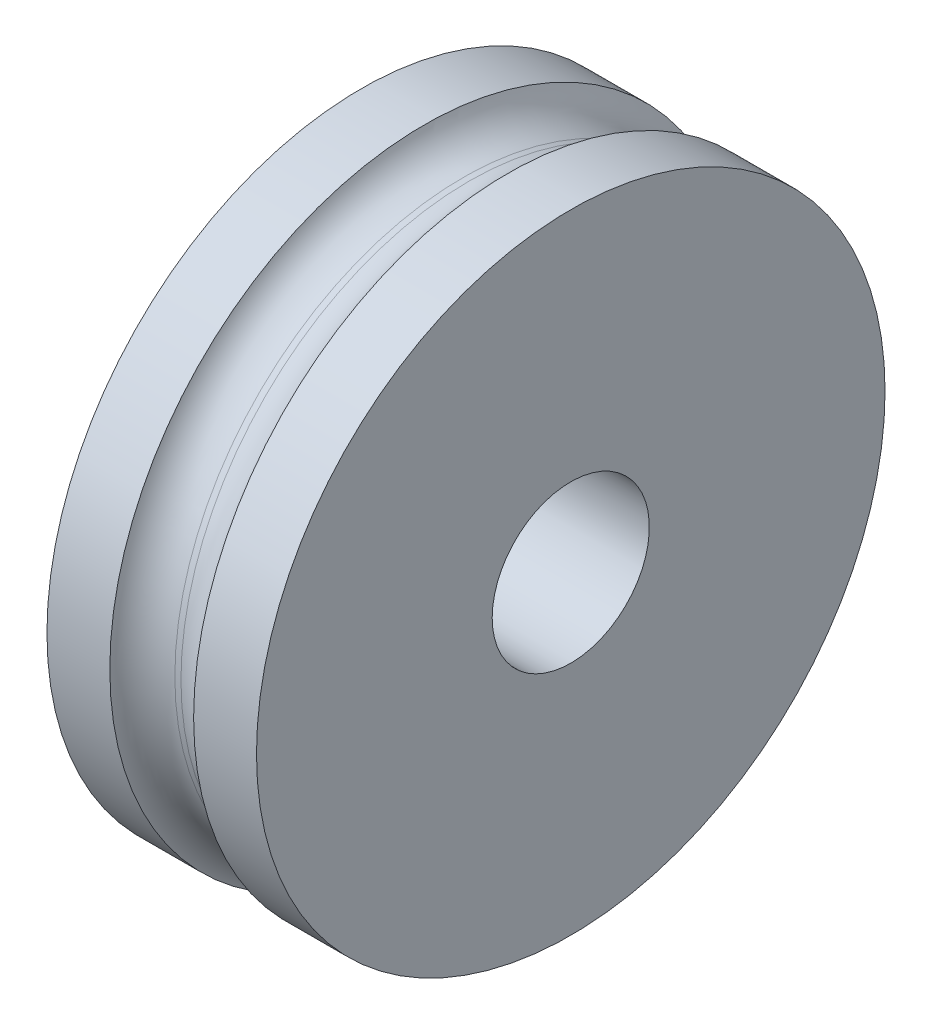
ISO-10303-21;
HEADER;
FILE_DESCRIPTION(('STEP AP214'),'2;1');
FILE_NAME('part.step','',(''),(''),'','','');
FILE_SCHEMA(('AUTOMOTIVE_DESIGN { 1 0 10303 214 1 1 1 1 }'));
ENDSEC;
DATA;
#1=APPLICATION_CONTEXT('core data for automotive mechanical design processes');
#2=APPLICATION_PROTOCOL_DEFINITION('international standard','automotive_design',2000,#1);
#3=PRODUCT_CONTEXT('',#1,'mechanical');
#4=PRODUCT('Part','Part','',(#3));
#5=PRODUCT_RELATED_PRODUCT_CATEGORY('part','',(#4));
#6=PRODUCT_DEFINITION_FORMATION('','',#4);
#7=PRODUCT_DEFINITION_CONTEXT('part definition',#1,'design');
#8=PRODUCT_DEFINITION('design','',#6,#7);
#9=PRODUCT_DEFINITION_SHAPE('','',#8);
#10=(LENGTH_UNIT() NAMED_UNIT(*) SI_UNIT(.MILLI.,.METRE.));
#11=(NAMED_UNIT(*) PLANE_ANGLE_UNIT() SI_UNIT($,.RADIAN.));
#12=(NAMED_UNIT(*) SI_UNIT($,.STERADIAN.) SOLID_ANGLE_UNIT());
#13=UNCERTAINTY_MEASURE_WITH_UNIT(LENGTH_MEASURE(1.E-05),#10,'distance_accuracy_value','');
#14=(GEOMETRIC_REPRESENTATION_CONTEXT(3) GLOBAL_UNCERTAINTY_ASSIGNED_CONTEXT((#13)) GLOBAL_UNIT_ASSIGNED_CONTEXT((#10,
#11,#12)) REPRESENTATION_CONTEXT('',''));
#15=CARTESIAN_POINT('',(0.,0.,0.));
#16=DIRECTION('',(0.,0.,1.));
#17=DIRECTION('',(1.,0.,0.));
#18=AXIS2_PLACEMENT_3D('',#15,#16,#17);
#19=CARTESIAN_POINT('',(-4.18700961347399,0.,0.));
#20=DIRECTION('',(-1.,0.,0.));
#21=DIRECTION('',(0.,0.,1.));
#22=AXIS2_PLACEMENT_3D('',#19,#20,#21);
#23=CYLINDRICAL_SURFACE('',#22,19.05);
#24=CARTESIAN_POINT('',(2.54,0.,0.));
#25=DIRECTION('',(-1.,0.,0.));
#26=DIRECTION('',(0.,0.,1.));
#27=AXIS2_PLACEMENT_3D('',#24,#25,#26);
#28=CIRCLE('',#27,19.05);
#29=CARTESIAN_POINT('',(2.54,0.,19.05));
#30=VERTEX_POINT('',#29);
#31=EDGE_CURVE('E44',#30,#30,#28,.T.);
#32=ORIENTED_EDGE('',*,*,#31,.F.);
#33=EDGE_LOOP('',(#32));
#34=FACE_BOUND('',#33,.T.);
#35=CARTESIAN_POINT('',(6.35,0.,0.));
#36=DIRECTION('',(-1.,0.,0.));
#37=DIRECTION('',(0.,0.,1.));
#38=AXIS2_PLACEMENT_3D('',#35,#36,#37);
#39=CIRCLE('',#38,19.05);
#40=CARTESIAN_POINT('',(6.35,0.,19.05));
#41=VERTEX_POINT('',#40);
#42=EDGE_CURVE('E62',#41,#41,#39,.T.);
#43=ORIENTED_EDGE('',*,*,#42,.T.);
#44=EDGE_LOOP('',(#43));
#45=FACE_BOUND('',#44,.T.);
#46=ADVANCED_FACE('F33',(#34,#45),#23,.T.);
#47=CARTESIAN_POINT('',(-4.18700961347399,0.,0.));
#48=DIRECTION('',(-1.,0.,0.));
#49=DIRECTION('',(0.,0.,1.));
#50=AXIS2_PLACEMENT_3D('',#47,#48,#49);
#51=CYLINDRICAL_SURFACE('',#50,17.4625);
#52=CARTESIAN_POINT('',(0.185356980347127,0.,0.));
#53=DIRECTION('',(1.,0.,0.));
#54=DIRECTION('',(0.,0.,-1.));
#55=AXIS2_PLACEMENT_3D('',#52,#53,#54);
#56=CIRCLE('',#55,17.4625);
#57=CARTESIAN_POINT('',(0.185356980347127,0.,-17.4625));
#58=VERTEX_POINT('',#57);
#59=EDGE_CURVE('E10',#58,#58,#56,.F.);
#60=ORIENTED_EDGE('',*,*,#59,.T.);
#61=EDGE_LOOP('',(#60));
#62=FACE_BOUND('',#61,.T.);
#63=CARTESIAN_POINT('',(-0.185356980347127,0.,0.));
#64=DIRECTION('',(-1.,0.,0.));
#65=DIRECTION('',(0.,0.,1.));
#66=AXIS2_PLACEMENT_3D('',#63,#64,#65);
#67=CIRCLE('',#66,17.4625);
#68=CARTESIAN_POINT('',(-0.185356980347127,0.,17.4625));
#69=VERTEX_POINT('',#68);
#70=EDGE_CURVE('E40',#69,#69,#67,.F.);
#71=ORIENTED_EDGE('',*,*,#70,.T.);
#72=EDGE_LOOP('',(#71));
#73=FACE_BOUND('',#72,.T.);
#74=ADVANCED_FACE('F89',(#62,#73),#51,.T.);
#75=CARTESIAN_POINT('',(-4.18700961347399,0.,0.));
#76=DIRECTION('',(-1.,0.,0.));
#77=DIRECTION('',(0.,0.,1.));
#78=AXIS2_PLACEMENT_3D('',#75,#76,#77);
#79=CYLINDRICAL_SURFACE('',#78,19.05);
#80=CARTESIAN_POINT('',(-6.35,0.,0.));
#81=DIRECTION('',(-1.,0.,0.));
#82=DIRECTION('',(0.,0.,1.));
#83=AXIS2_PLACEMENT_3D('',#80,#81,#82);
#84=CIRCLE('',#83,19.05);
#85=CARTESIAN_POINT('',(-6.35,0.,19.05));
#86=VERTEX_POINT('',#85);
#87=EDGE_CURVE('E53',#86,#86,#84,.T.);
#88=ORIENTED_EDGE('',*,*,#87,.F.);
#89=EDGE_LOOP('',(#88));
#90=FACE_BOUND('',#89,.T.);
#91=CARTESIAN_POINT('',(-2.54,0.,0.));
#92=DIRECTION('',(-1.,0.,0.));
#93=DIRECTION('',(0.,0.,1.));
#94=AXIS2_PLACEMENT_3D('',#91,#92,#93);
#95=CIRCLE('',#94,19.05);
#96=CARTESIAN_POINT('',(-2.54,0.,19.05));
#97=VERTEX_POINT('',#96);
#98=EDGE_CURVE('E48',#97,#97,#95,.T.);
#99=ORIENTED_EDGE('',*,*,#98,.T.);
#100=EDGE_LOOP('',(#99));
#101=FACE_BOUND('',#100,.T.);
#102=ADVANCED_FACE('F83',(#90,#101),#79,.T.);
#103=CARTESIAN_POINT('',(-6.35,4.7625,0.));
#104=DIRECTION('',(1.,0.,0.));
#105=DIRECTION('',(0.,0.,-1.));
#106=AXIS2_PLACEMENT_3D('',#103,#104,#105);
#107=PLANE('',#106);
#108=CARTESIAN_POINT('',(-6.35,0.,0.));
#109=DIRECTION('',(-1.,0.,0.));
#110=DIRECTION('',(0.,0.,1.));
#111=AXIS2_PLACEMENT_3D('',#108,#109,#110);
#112=CIRCLE('',#111,4.7625);
#113=CARTESIAN_POINT('',(-6.35,0.,4.7625));
#114=VERTEX_POINT('',#113);
#115=EDGE_CURVE('E56',#114,#114,#112,.T.);
#116=ORIENTED_EDGE('',*,*,#115,.F.);
#117=EDGE_LOOP('',(#116));
#118=FACE_BOUND('',#117,.T.);
#119=ORIENTED_EDGE('',*,*,#87,.T.);
#120=EDGE_LOOP('',(#119));
#121=FACE_BOUND('',#120,.T.);
#122=ADVANCED_FACE('F77',(#118,#121),#107,.F.);
#123=CARTESIAN_POINT('',(-4.18700961347399,0.,0.));
#124=DIRECTION('',(-1.,0.,0.));
#125=DIRECTION('',(0.,0.,1.));
#126=AXIS2_PLACEMENT_3D('',#123,#124,#125);
#127=CYLINDRICAL_SURFACE('',#126,4.7625);
#128=CARTESIAN_POINT('',(6.35,0.,0.));
#129=DIRECTION('',(-1.,0.,0.));
#130=DIRECTION('',(0.,0.,1.));
#131=AXIS2_PLACEMENT_3D('',#128,#129,#130);
#132=CIRCLE('',#131,4.7625);
#133=CARTESIAN_POINT('',(6.35,0.,4.7625));
#134=VERTEX_POINT('',#133);
#135=EDGE_CURVE('E59',#134,#134,#132,.T.);
#136=ORIENTED_EDGE('',*,*,#135,.F.);
#137=EDGE_LOOP('',(#136));
#138=FACE_BOUND('',#137,.T.);
#139=ORIENTED_EDGE('',*,*,#115,.T.);
#140=EDGE_LOOP('',(#139));
#141=FACE_BOUND('',#140,.T.);
#142=ADVANCED_FACE('F71',(#138,#141),#127,.F.);
#143=CARTESIAN_POINT('',(6.35,4.7625,0.));
#144=DIRECTION('',(-1.,0.,0.));
#145=DIRECTION('',(0.,0.,1.));
#146=AXIS2_PLACEMENT_3D('',#143,#144,#145);
#147=PLANE('',#146);
#148=ORIENTED_EDGE('',*,*,#42,.F.);
#149=EDGE_LOOP('',(#148));
#150=FACE_BOUND('',#149,.T.);
#151=ORIENTED_EDGE('',*,*,#135,.T.);
#152=EDGE_LOOP('',(#151));
#153=FACE_BOUND('',#152,.T.);
#154=ADVANCED_FACE('F67',(#150,#153),#147,.F.);
#155=CARTESIAN_POINT('',(0.185356980347127,0.,0.));
#156=DIRECTION('',(1.,0.,0.));
#157=DIRECTION('',(0.,0.,-1.));
#158=AXIS2_PLACEMENT_3D('',#155,#156,#157);
#159=TOROIDAL_SURFACE('',#158,20.0025,2.54);
#160=ORIENTED_EDGE('',*,*,#31,.T.);
#161=EDGE_LOOP('',(#160));
#162=FACE_BOUND('',#161,.T.);
#163=ORIENTED_EDGE('',*,*,#59,.F.);
#164=EDGE_LOOP('',(#163));
#165=FACE_BOUND('',#164,.T.);
#166=ADVANCED_FACE('F70',(#162,#165),#159,.F.);
#167=CARTESIAN_POINT('',(-0.185356980347127,0.,0.));
#168=DIRECTION('',(-1.,0.,0.));
#169=DIRECTION('',(0.,0.,1.));
#170=AXIS2_PLACEMENT_3D('',#167,#168,#169);
#171=TOROIDAL_SURFACE('',#170,20.0025,2.54);
#172=ORIENTED_EDGE('',*,*,#70,.F.);
#173=EDGE_LOOP('',(#172));
#174=FACE_BOUND('',#173,.T.);
#175=ORIENTED_EDGE('',*,*,#98,.F.);
#176=EDGE_LOOP('',(#175));
#177=FACE_BOUND('',#176,.T.);
#178=ADVANCED_FACE('F35',(#174,#177),#171,.F.);
#179=CLOSED_SHELL('',(#46,#74,#102,#122,#142,#154,#166,#178));
#180=MANIFOLD_SOLID_BREP('B2',#179);
#181=ADVANCED_BREP_SHAPE_REPRESENTATION('',(#18,#180),#14);
#182=SHAPE_DEFINITION_REPRESENTATION(#9,#181);
ENDSEC;
END-ISO-10303-21;
